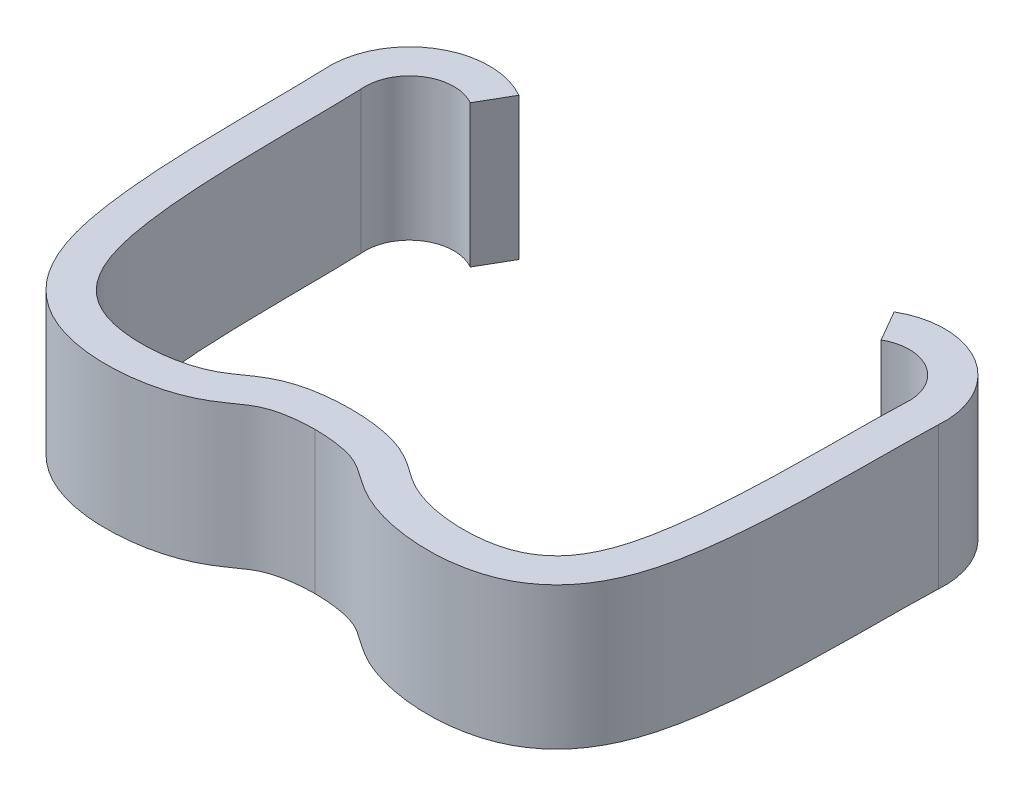
ISO-10303-21;
HEADER;
FILE_DESCRIPTION(('STEP AP214'),'2;1');
FILE_NAME('part.step','',(''),(''),'','','');
FILE_SCHEMA(('AUTOMOTIVE_DESIGN { 1 0 10303 214 1 1 1 1 }'));
ENDSEC;
DATA;
#1=APPLICATION_CONTEXT('core data for automotive mechanical design processes');
#2=APPLICATION_PROTOCOL_DEFINITION('international standard','automotive_design',2000,#1);
#3=PRODUCT_CONTEXT('',#1,'mechanical');
#4=PRODUCT('Part','Part','',(#3));
#5=PRODUCT_RELATED_PRODUCT_CATEGORY('part','',(#4));
#6=PRODUCT_DEFINITION_FORMATION('','',#4);
#7=PRODUCT_DEFINITION_CONTEXT('part definition',#1,'design');
#8=PRODUCT_DEFINITION('design','',#6,#7);
#9=PRODUCT_DEFINITION_SHAPE('','',#8);
#10=(LENGTH_UNIT() NAMED_UNIT(*) SI_UNIT(.MILLI.,.METRE.));
#11=(NAMED_UNIT(*) PLANE_ANGLE_UNIT() SI_UNIT($,.RADIAN.));
#12=(NAMED_UNIT(*) SI_UNIT($,.STERADIAN.) SOLID_ANGLE_UNIT());
#13=UNCERTAINTY_MEASURE_WITH_UNIT(LENGTH_MEASURE(1.E-05),#10,'distance_accuracy_value','');
#14=(GEOMETRIC_REPRESENTATION_CONTEXT(3) GLOBAL_UNCERTAINTY_ASSIGNED_CONTEXT((#13)) GLOBAL_UNIT_ASSIGNED_CONTEXT((#10,
#11,#12)) REPRESENTATION_CONTEXT('',''));
#15=CARTESIAN_POINT('',(0.,0.,0.));
#16=DIRECTION('',(0.,0.,1.));
#17=DIRECTION('',(1.,0.,0.));
#18=AXIS2_PLACEMENT_3D('',#15,#16,#17);
#19=CARTESIAN_POINT('',(-16.,10.,0.));
#20=DIRECTION('',(0.,-1.,0.));
#21=DIRECTION('',(0.,0.,-1.));
#22=AXIS2_PLACEMENT_3D('',#19,#20,#21);
#23=CYLINDRICAL_SURFACE('',#22,5.625);
#24=CARTESIAN_POINT('',(-16.,0.,0.));
#25=DIRECTION('',(0.,1.,0.));
#26=DIRECTION('',(0.,0.,1.));
#27=AXIS2_PLACEMENT_3D('',#24,#25,#26);
#28=CIRCLE('',#27,5.625);
#29=CARTESIAN_POINT('',(-13.1875,0.,-4.87139289628746));
#30=VERTEX_POINT('',#29);
#31=CARTESIAN_POINT('',(-21.6076901333347,0.,0.44094939448909));
#32=VERTEX_POINT('',#31);
#33=EDGE_CURVE('E208',#30,#32,#28,.T.);
#34=ORIENTED_EDGE('',*,*,#33,.T.);
#35=DIRECTION('',(0.,-1.,0.));
#36=VECTOR('',#35,1.);
#37=CARTESIAN_POINT('',(-21.6076901333347,10.,0.44094939448909));
#38=LINE('',#37,#36);
#39=CARTESIAN_POINT('',(-21.6076901333347,10.,0.44094939448909));
#40=VERTEX_POINT('',#39);
#41=EDGE_CURVE('E11',#40,#32,#38,.T.);
#42=ORIENTED_EDGE('',*,*,#41,.F.);
#43=CARTESIAN_POINT('',(-16.,10.,0.));
#44=DIRECTION('',(0.,1.,0.));
#45=DIRECTION('',(0.,0.,1.));
#46=AXIS2_PLACEMENT_3D('',#43,#44,#45);
#47=CIRCLE('',#46,5.625);
#48=CARTESIAN_POINT('',(-13.1875,10.,-4.87139289628746));
#49=VERTEX_POINT('',#48);
#50=EDGE_CURVE('E231',#49,#40,#47,.T.);
#51=ORIENTED_EDGE('',*,*,#50,.F.);
#52=DIRECTION('',(0.,-1.,0.));
#53=VECTOR('',#52,1.);
#54=CARTESIAN_POINT('',(-13.1875,10.,-4.87139289628746));
#55=LINE('',#54,#53);
#56=EDGE_CURVE('E207',#49,#30,#55,.T.);
#57=ORIENTED_EDGE('',*,*,#56,.T.);
#58=EDGE_LOOP('',(#34,#42,#51,#57));
#59=FACE_BOUND('',#58,.T.);
#60=ADVANCED_FACE('F35',(#59),#23,.T.);
#61=CARTESIAN_POINT('',(-21.6219283607129,10.,0.123890118522856));
#62=CARTESIAN_POINT('',(-21.6146337999332,10.,0.270907458622705));
#63=CARTESIAN_POINT('',(-21.602444684136,10.,0.555639378549982));
#64=CARTESIAN_POINT('',(-21.581483098417,10.,1.20057483207771));
#65=CARTESIAN_POINT('',(-21.5634413606094,10.,2.08484165586611));
#66=CARTESIAN_POINT('',(-21.5499995461205,10.,3.26385352737051));
#67=CARTESIAN_POINT('',(-21.5372211205893,10.,4.95933485482449));
#68=CARTESIAN_POINT('',(-21.5189118447884,10.,7.26459006225195));
#69=CARTESIAN_POINT('',(-21.4538134826111,10.,10.1846515740743));
#70=CARTESIAN_POINT('',(-21.3050356283683,10.,13.1265244944977));
#71=CARTESIAN_POINT('',(-21.0269231651929,10.,15.9665863770045));
#72=CARTESIAN_POINT('',(-20.5704017791859,10.,18.6069338161627));
#73=CARTESIAN_POINT('',(-19.7776823708247,10.,21.0892285009909));
#74=CARTESIAN_POINT('',(-18.3770463268046,10.,23.3779332616362));
#75=CARTESIAN_POINT('',(-16.1351830401088,10.,25.1476529540987));
#76=CARTESIAN_POINT('',(-13.2678501313841,10.,25.9978332084667));
#77=CARTESIAN_POINT('',(-10.7172773804907,10.,26.0650175697744));
#78=CARTESIAN_POINT('',(-8.67143886671049,10.,25.7904428629924));
#79=CARTESIAN_POINT('',(-7.41767780962246,10.,25.4638715882414));
#80=CARTESIAN_POINT('',(-6.44842602371671,10.,25.0956166688921));
#81=CARTESIAN_POINT('',(-5.72988490447921,10.,24.7517410122022));
#82=CARTESIAN_POINT('',(-5.0761458871409,10.,24.3542968347593));
#83=CARTESIAN_POINT('',(-4.39264050595582,10.,23.8768194772862));
#84=CARTESIAN_POINT('',(-3.7655304640169,10.,23.4318841711946));
#85=CARTESIAN_POINT('',(-3.19400356367894,10.,23.134099238582));
#86=CARTESIAN_POINT('',(-2.54250472768997,10.,22.9160334848559));
#87=CARTESIAN_POINT('',(-1.90399652052193,10.,22.7726014723141));
#88=CARTESIAN_POINT('',(-1.20595712813709,10.,22.6825803810841));
#89=CARTESIAN_POINT('',(-0.544804090207386,10.,22.6385258496257));
#90=CARTESIAN_POINT('',(-0.155887299716033,10.,22.6271535118445));
#91=CARTESIAN_POINT('',(0.0313759444706018,10.,22.624803102268));
#92=B_SPLINE_CURVE_WITH_KNOTS('',3,(#61,#62,#63,#64,#65,#66,#67,#68,#69,#70,#71,#72,#73,#74,#75,
#76,#77,#78,#79,#80,#81,#82,#83,#84,#85,#86,#87,#88,#89,#90,#91),.UNSPECIFIED.,.F.,.F.,(4,1,1,1,
1,1,1,1,1,1,1,1,1,1,1,1,1,1,1,1,1,1,1,1,1,1,1,1,4),(0.,0.015625,0.03125,0.0625,0.09375,0.125,
0.1875,0.25,0.3125,0.375,0.4375,0.5,0.5625,0.625,0.6875,0.75,0.78125,0.8125,0.828125,0.84375,
0.859375,0.875,0.90625,0.9375,0.953125,0.96875,0.984375,0.9921875,1.),.UNSPECIFIED.);
#93=DIRECTION('',(0.,-1.,0.));
#94=VECTOR('',#93,1.);
#95=SURFACE_OF_LINEAR_EXTRUSION('',#92,#94);
#96=CARTESIAN_POINT('',(-21.6219283607129,0.,0.123890118522856));
#97=CARTESIAN_POINT('',(-21.6146337999332,0.,0.270907458622705));
#98=CARTESIAN_POINT('',(-21.602444684136,0.,0.555639378549982));
#99=CARTESIAN_POINT('',(-21.581483098417,0.,1.20057483207771));
#100=CARTESIAN_POINT('',(-21.5634413606094,0.,2.08484165586611));
#101=CARTESIAN_POINT('',(-21.5499995461205,0.,3.26385352737051));
#102=CARTESIAN_POINT('',(-21.5372211205893,0.,4.95933485482449));
#103=CARTESIAN_POINT('',(-21.5189118447884,0.,7.26459006225195));
#104=CARTESIAN_POINT('',(-21.4538134826111,0.,10.1846515740743));
#105=CARTESIAN_POINT('',(-21.3050356283683,0.,13.1265244944977));
#106=CARTESIAN_POINT('',(-21.0269231651929,0.,15.9665863770045));
#107=CARTESIAN_POINT('',(-20.5704017791859,0.,18.6069338161627));
#108=CARTESIAN_POINT('',(-19.7776823708247,0.,21.0892285009909));
#109=CARTESIAN_POINT('',(-18.3770463268046,0.,23.3779332616362));
#110=CARTESIAN_POINT('',(-16.1351830401088,0.,25.1476529540987));
#111=CARTESIAN_POINT('',(-13.2678501313841,0.,25.9978332084667));
#112=CARTESIAN_POINT('',(-10.7172773804907,0.,26.0650175697744));
#113=CARTESIAN_POINT('',(-8.67143886671049,0.,25.7904428629924));
#114=CARTESIAN_POINT('',(-7.41767780962246,0.,25.4638715882414));
#115=CARTESIAN_POINT('',(-6.44842602371671,0.,25.0956166688921));
#116=CARTESIAN_POINT('',(-5.72988490447921,0.,24.7517410122022));
#117=CARTESIAN_POINT('',(-5.0761458871409,0.,24.3542968347593));
#118=CARTESIAN_POINT('',(-4.39264050595582,0.,23.8768194772862));
#119=CARTESIAN_POINT('',(-3.7655304640169,0.,23.4318841711946));
#120=CARTESIAN_POINT('',(-3.19400356367894,0.,23.134099238582));
#121=CARTESIAN_POINT('',(-2.54250472768997,0.,22.9160334848559));
#122=CARTESIAN_POINT('',(-1.90399652052193,0.,22.7726014723141));
#123=CARTESIAN_POINT('',(-1.20595712813709,0.,22.6825803810841));
#124=CARTESIAN_POINT('',(-0.544804090207386,0.,22.6385258496257));
#125=CARTESIAN_POINT('',(-0.155887299716033,0.,22.6271535118445));
#126=CARTESIAN_POINT('',(0.0313759444706018,0.,22.624803102268));
#127=B_SPLINE_CURVE_WITH_KNOTS('',3,(#96,#97,#98,#99,#100,#101,#102,#103,#104,#105,#106,#107,
#108,#109,#110,#111,#112,#113,#114,#115,#116,#117,#118,#119,#120,#121,#122,#123,#124,#125,#126),
.UNSPECIFIED.,.F.,.F.,(4,1,1,1,1,1,1,1,1,1,1,1,1,1,1,1,1,1,1,1,1,1,1,1,1,1,1,1,4),(0.,0.015625,
0.03125,0.0625,0.09375,0.125,0.1875,0.25,0.3125,0.375,0.4375,0.5,0.5625,0.625,0.6875,0.75,
0.78125,0.8125,0.828125,0.84375,0.859375,0.875,0.90625,0.9375,0.953125,0.96875,0.984375,
0.9921875,1.),.UNSPECIFIED.);
#128=CARTESIAN_POINT('',(-3.37868120152851E-08,0.,22.6252270911521));
#129=VERTEX_POINT('',#128);
#130=EDGE_CURVE('E211',#32,#129,#127,.T.);
#131=ORIENTED_EDGE('',*,*,#130,.T.);
#132=DIRECTION('',(0.,-1.,0.));
#133=VECTOR('',#132,1.);
#134=CARTESIAN_POINT('',(0.,10.,22.6252270916409));
#135=LINE('',#134,#133);
#136=CARTESIAN_POINT('',(-3.37868120152851E-08,10.,22.6252270911521));
#137=VERTEX_POINT('',#136);
#138=EDGE_CURVE('E129',#129,#137,#135,.F.);
#139=ORIENTED_EDGE('',*,*,#138,.T.);
#140=EDGE_CURVE('E81',#40,#137,#92,.T.);
#141=ORIENTED_EDGE('',*,*,#140,.F.);
#142=ORIENTED_EDGE('',*,*,#41,.T.);
#143=EDGE_LOOP('',(#131,#139,#141,#142));
#144=FACE_BOUND('',#143,.T.);
#145=ADVANCED_FACE('F187',(#144),#95,.F.);
#146=CARTESIAN_POINT('',(-19.125,10.,0.));
#147=CARTESIAN_POINT('',(-18.9378789635887,10.,3.77130822273864));
#148=CARTESIAN_POINT('',(-19.429246011893,10.,16.1110240452031));
#149=CARTESIAN_POINT('',(-16.0735226230496,10.,24.1093593427401));
#150=CARTESIAN_POINT('',(-6.26928183090484,10.,23.3561417046772));
#151=CARTESIAN_POINT('',(-4.45766076868446,10.,20.1809497332489));
#152=CARTESIAN_POINT('',(0.,10.,20.125));
#153=B_SPLINE_CURVE_WITH_KNOTS('',3,(#146,#147,#148,#149,#150,#151,#152),.UNSPECIFIED.,.F.,.F.,
(4,1,1,1,4),(0.,0.388495821340989,0.663537305837103,0.845127061669236,1.),.UNSPECIFIED.);
#154=DIRECTION('',(0.,-1.,0.));
#155=VECTOR('',#154,1.);
#156=SURFACE_OF_LINEAR_EXTRUSION('',#153,#155);
#157=CARTESIAN_POINT('',(-19.125,0.,0.));
#158=CARTESIAN_POINT('',(-18.9378789635887,0.,3.77130822273864));
#159=CARTESIAN_POINT('',(-19.429246011893,0.,16.1110240452031));
#160=CARTESIAN_POINT('',(-16.0735226230496,0.,24.1093593427401));
#161=CARTESIAN_POINT('',(-6.26928183090484,0.,23.3561417046772));
#162=CARTESIAN_POINT('',(-4.45766076868446,0.,20.1809497332489));
#163=CARTESIAN_POINT('',(0.,0.,20.125));
#164=B_SPLINE_CURVE_WITH_KNOTS('',3,(#157,#158,#159,#160,#161,#162,#163),.UNSPECIFIED.,.F.,.F.,
(4,1,1,1,4),(0.,0.388495821340989,0.663537305837103,0.845127061669236,1.),.UNSPECIFIED.);
#165=CARTESIAN_POINT('',(-19.1120360022778,0.,0.284353513300806));
#166=VERTEX_POINT('',#165);
#167=CARTESIAN_POINT('',(0.,0.,20.125));
#168=VERTEX_POINT('',#167);
#169=EDGE_CURVE('E216',#166,#168,#164,.T.);
#170=ORIENTED_EDGE('',*,*,#169,.F.);
#171=DIRECTION('',(0.,-1.,0.));
#172=VECTOR('',#171,1.);
#173=CARTESIAN_POINT('',(-19.1120360022778,10.,0.284353513300806));
#174=LINE('',#173,#172);
#175=CARTESIAN_POINT('',(-19.1120360022778,10.,0.284353513300806));
#176=VERTEX_POINT('',#175);
#177=EDGE_CURVE('E234',#176,#166,#174,.T.);
#178=ORIENTED_EDGE('',*,*,#177,.F.);
#179=CARTESIAN_POINT('',(0.,10.,20.125));
#180=VERTEX_POINT('',#179);
#181=EDGE_CURVE('E190',#176,#180,#153,.T.);
#182=ORIENTED_EDGE('',*,*,#181,.T.);
#183=DIRECTION('',(0.,-1.,0.));
#184=VECTOR('',#183,1.);
#185=CARTESIAN_POINT('',(0.,10.,20.125));
#186=LINE('',#185,#184);
#187=EDGE_CURVE('E43',#180,#168,#186,.T.);
#188=ORIENTED_EDGE('',*,*,#187,.T.);
#189=EDGE_LOOP('',(#170,#178,#182,#188));
#190=FACE_BOUND('',#189,.T.);
#191=ADVANCED_FACE('F183',(#190),#156,.T.);
#192=CARTESIAN_POINT('',(-16.,10.,0.));
#193=DIRECTION('',(0.,-1.,0.));
#194=DIRECTION('',(0.,0.,-1.));
#195=AXIS2_PLACEMENT_3D('',#192,#193,#194);
#196=CYLINDRICAL_SURFACE('',#195,3.125);
#197=CARTESIAN_POINT('',(-16.,0.,0.));
#198=DIRECTION('',(0.,1.,0.));
#199=DIRECTION('',(0.,0.,1.));
#200=AXIS2_PLACEMENT_3D('',#197,#198,#199);
#201=CIRCLE('',#200,3.125);
#202=CARTESIAN_POINT('',(-14.4375,0.,-2.70632938682637));
#203=VERTEX_POINT('',#202);
#204=EDGE_CURVE('E224',#203,#166,#201,.T.);
#205=ORIENTED_EDGE('',*,*,#204,.F.);
#206=DIRECTION('',(0.,-1.,0.));
#207=VECTOR('',#206,1.);
#208=CARTESIAN_POINT('',(-14.4375,10.,-2.70632938682637));
#209=LINE('',#208,#207);
#210=CARTESIAN_POINT('',(-14.4375,10.,-2.70632938682637));
#211=VERTEX_POINT('',#210);
#212=EDGE_CURVE('E71',#211,#203,#209,.T.);
#213=ORIENTED_EDGE('',*,*,#212,.F.);
#214=CARTESIAN_POINT('',(-16.,10.,0.));
#215=DIRECTION('',(0.,1.,0.));
#216=DIRECTION('',(0.,0.,1.));
#217=AXIS2_PLACEMENT_3D('',#214,#215,#216);
#218=CIRCLE('',#217,3.125);
#219=EDGE_CURVE('E196',#211,#176,#218,.T.);
#220=ORIENTED_EDGE('',*,*,#219,.T.);
#221=ORIENTED_EDGE('',*,*,#177,.T.);
#222=EDGE_LOOP('',(#205,#213,#220,#221));
#223=FACE_BOUND('',#222,.T.);
#224=ADVANCED_FACE('F180',(#223),#196,.F.);
#225=CARTESIAN_POINT('',(-12.,10.,-6.92820323027552));
#226=DIRECTION('',(-0.866025403784438,0.,-0.500000000000001));
#227=DIRECTION('',(-0.500000000000001,0.,0.866025403784438));
#228=AXIS2_PLACEMENT_3D('',#225,#226,#227);
#229=PLANE('',#228);
#230=DIRECTION('',(0.500000000000001,0.,-0.866025403784438));
#231=VECTOR('',#230,1.);
#232=CARTESIAN_POINT('',(-12.,0.,-6.92820323027552));
#233=LINE('',#232,#231);
#234=EDGE_CURVE('E74',#203,#30,#233,.T.);
#235=ORIENTED_EDGE('',*,*,#234,.T.);
#236=ORIENTED_EDGE('',*,*,#56,.F.);
#237=DIRECTION('',(0.500000000000001,0.,-0.866025403784438));
#238=VECTOR('',#237,1.);
#239=CARTESIAN_POINT('',(-12.,10.,-6.92820323027552));
#240=LINE('',#239,#238);
#241=EDGE_CURVE('E51',#211,#49,#240,.T.);
#242=ORIENTED_EDGE('',*,*,#241,.F.);
#243=ORIENTED_EDGE('',*,*,#212,.T.);
#244=EDGE_LOOP('',(#235,#236,#242,#243));
#245=FACE_BOUND('',#244,.T.);
#246=ADVANCED_FACE('F174',(#245),#229,.F.);
#247=CARTESIAN_POINT('',(0.,10.,0.));
#248=DIRECTION('',(0.,1.,0.));
#249=DIRECTION('',(0.,0.,1.));
#250=AXIS2_PLACEMENT_3D('',#247,#248,#249);
#251=PLANE('',#250);
#252=ORIENTED_EDGE('',*,*,#140,.T.);
#253=CARTESIAN_POINT('',(21.6219283607129,10.,0.123890118522856));
#254=CARTESIAN_POINT('',(21.6146337999332,10.,0.270907458622705));
#255=CARTESIAN_POINT('',(21.602444684136,10.,0.555639378549982));
#256=CARTESIAN_POINT('',(21.581483098417,10.,1.20057483207771));
#257=CARTESIAN_POINT('',(21.5634413606094,10.,2.08484165586611));
#258=CARTESIAN_POINT('',(21.5499995461205,10.,3.26385352737051));
#259=CARTESIAN_POINT('',(21.5372211205893,10.,4.95933485482449));
#260=CARTESIAN_POINT('',(21.5189118447884,10.,7.26459006225195));
#261=CARTESIAN_POINT('',(21.4538134826111,10.,10.1846515740743));
#262=CARTESIAN_POINT('',(21.3050356283683,10.,13.1265244944977));
#263=CARTESIAN_POINT('',(21.0269231651929,10.,15.9665863770045));
#264=CARTESIAN_POINT('',(20.5704017791859,10.,18.6069338161627));
#265=CARTESIAN_POINT('',(19.7776823708247,10.,21.0892285009909));
#266=CARTESIAN_POINT('',(18.3770463268046,10.,23.3779332616362));
#267=CARTESIAN_POINT('',(16.1351830401088,10.,25.1476529540987));
#268=CARTESIAN_POINT('',(13.2678501313841,10.,25.9978332084667));
#269=CARTESIAN_POINT('',(10.7172773804907,10.,26.0650175697744));
#270=CARTESIAN_POINT('',(8.67143886671049,10.,25.7904428629924));
#271=CARTESIAN_POINT('',(7.41767780962246,10.,25.4638715882414));
#272=CARTESIAN_POINT('',(6.44842602371671,10.,25.0956166688921));
#273=CARTESIAN_POINT('',(5.72988490447921,10.,24.7517410122022));
#274=CARTESIAN_POINT('',(5.0761458871409,10.,24.3542968347593));
#275=CARTESIAN_POINT('',(4.39264050595582,10.,23.8768194772862));
#276=CARTESIAN_POINT('',(3.7655304640169,10.,23.4318841711946));
#277=CARTESIAN_POINT('',(3.19400356367894,10.,23.134099238582));
#278=CARTESIAN_POINT('',(2.54250472768997,10.,22.9160334848559));
#279=CARTESIAN_POINT('',(1.90399652052193,10.,22.7726014723141));
#280=CARTESIAN_POINT('',(1.20595712813709,10.,22.6825803810841));
#281=CARTESIAN_POINT('',(0.544804090207386,10.,22.6385258496257));
#282=CARTESIAN_POINT('',(0.155887299716033,10.,22.6271535118445));
#283=CARTESIAN_POINT('',(-0.0313759444706018,10.,22.624803102268));
#284=B_SPLINE_CURVE_WITH_KNOTS('',3,(#253,#254,#255,#256,#257,#258,#259,#260,#261,#262,#263,
#264,#265,#266,#267,#268,#269,#270,#271,#272,#273,#274,#275,#276,#277,#278,#279,#280,#281,#282,
#283),.UNSPECIFIED.,.F.,.F.,(4,1,1,1,1,1,1,1,1,1,1,1,1,1,1,1,1,1,1,1,1,1,1,1,1,1,1,1,4),(0.,
0.015625,0.03125,0.0625,0.09375,0.125,0.1875,0.25,0.3125,0.375,0.4375,0.5,0.5625,0.625,0.6875,
0.75,0.78125,0.8125,0.828125,0.84375,0.859375,0.875,0.90625,0.9375,0.953125,0.96875,0.984375,
0.9921875,1.),.UNSPECIFIED.);
#285=CARTESIAN_POINT('',(21.6076901333347,10.,0.44094939448909));
#286=VERTEX_POINT('',#285);
#287=EDGE_CURVE('E135',#286,#137,#284,.T.);
#288=ORIENTED_EDGE('',*,*,#287,.F.);
#289=CARTESIAN_POINT('',(16.,10.,0.));
#290=DIRECTION('',(0.,-1.,0.));
#291=DIRECTION('',(0.,0.,1.));
#292=AXIS2_PLACEMENT_3D('',#289,#290,#291);
#293=CIRCLE('',#292,5.625);
#294=CARTESIAN_POINT('',(13.1875,10.,-4.87139289628746));
#295=VERTEX_POINT('',#294);
#296=EDGE_CURVE('E121',#295,#286,#293,.T.);
#297=ORIENTED_EDGE('',*,*,#296,.F.);
#298=DIRECTION('',(-0.500000000000001,0.,-0.866025403784438));
#299=VECTOR('',#298,1.);
#300=CARTESIAN_POINT('',(12.,10.,-6.92820323027552));
#301=LINE('',#300,#299);
#302=CARTESIAN_POINT('',(14.4375,10.,-2.70632938682637));
#303=VERTEX_POINT('',#302);
#304=EDGE_CURVE('E134',#303,#295,#301,.T.);
#305=ORIENTED_EDGE('',*,*,#304,.F.);
#306=CARTESIAN_POINT('',(16.,10.,0.));
#307=DIRECTION('',(0.,-1.,0.));
#308=DIRECTION('',(0.,0.,1.));
#309=AXIS2_PLACEMENT_3D('',#306,#307,#308);
#310=CIRCLE('',#309,3.125);
#311=CARTESIAN_POINT('',(19.1120360022778,10.,0.284353513300806));
#312=VERTEX_POINT('',#311);
#313=EDGE_CURVE('E140',#303,#312,#310,.T.);
#314=ORIENTED_EDGE('',*,*,#313,.T.);
#315=CARTESIAN_POINT('',(19.125,10.,0.));
#316=CARTESIAN_POINT('',(18.9378789635887,10.,3.77130822273864));
#317=CARTESIAN_POINT('',(19.429246011893,10.,16.1110240452031));
#318=CARTESIAN_POINT('',(16.0735226230496,10.,24.1093593427401));
#319=CARTESIAN_POINT('',(6.26928183090484,10.,23.3561417046772));
#320=CARTESIAN_POINT('',(4.45766076868446,10.,20.1809497332489));
#321=CARTESIAN_POINT('',(0.,10.,20.125));
#322=B_SPLINE_CURVE_WITH_KNOTS('',3,(#315,#316,#317,#318,#319,#320,#321),.UNSPECIFIED.,.F.,.F.,
(4,1,1,1,4),(0.,0.388495821340989,0.663537305837103,0.845127061669236,1.),.UNSPECIFIED.);
#323=EDGE_CURVE('E142',#312,#180,#322,.T.);
#324=ORIENTED_EDGE('',*,*,#323,.T.);
#325=ORIENTED_EDGE('',*,*,#181,.F.);
#326=ORIENTED_EDGE('',*,*,#219,.F.);
#327=ORIENTED_EDGE('',*,*,#241,.T.);
#328=ORIENTED_EDGE('',*,*,#50,.T.);
#329=EDGE_LOOP('',(#252,#288,#297,#305,#314,#324,#325,#326,#327,#328));
#330=FACE_BOUND('',#329,.T.);
#331=ADVANCED_FACE('F133',(#330),#251,.T.);
#332=CARTESIAN_POINT('',(0.,0.,0.));
#333=DIRECTION('',(0.,1.,0.));
#334=DIRECTION('',(0.,0.,1.));
#335=AXIS2_PLACEMENT_3D('',#332,#333,#334);
#336=PLANE('',#335);
#337=ORIENTED_EDGE('',*,*,#169,.T.);
#338=CARTESIAN_POINT('',(19.125,0.,0.));
#339=CARTESIAN_POINT('',(18.9378789635887,0.,3.77130822273864));
#340=CARTESIAN_POINT('',(19.429246011893,0.,16.1110240452031));
#341=CARTESIAN_POINT('',(16.0735226230496,0.,24.1093593427401));
#342=CARTESIAN_POINT('',(6.26928183090484,0.,23.3561417046772));
#343=CARTESIAN_POINT('',(4.45766076868446,0.,20.1809497332489));
#344=CARTESIAN_POINT('',(0.,0.,20.125));
#345=B_SPLINE_CURVE_WITH_KNOTS('',3,(#338,#339,#340,#341,#342,#343,#344),.UNSPECIFIED.,.F.,.F.,
(4,1,1,1,4),(0.,0.388495821340989,0.663537305837103,0.845127061669236,1.),.UNSPECIFIED.);
#346=CARTESIAN_POINT('',(19.1120360022778,0.,0.284353513300806));
#347=VERTEX_POINT('',#346);
#348=EDGE_CURVE('E242',#347,#168,#345,.T.);
#349=ORIENTED_EDGE('',*,*,#348,.F.);
#350=CARTESIAN_POINT('',(16.,0.,0.));
#351=DIRECTION('',(0.,-1.,0.));
#352=DIRECTION('',(0.,0.,1.));
#353=AXIS2_PLACEMENT_3D('',#350,#351,#352);
#354=CIRCLE('',#353,3.125);
#355=CARTESIAN_POINT('',(14.4375,0.,-2.70632938682637));
#356=VERTEX_POINT('',#355);
#357=EDGE_CURVE('E260',#356,#347,#354,.T.);
#358=ORIENTED_EDGE('',*,*,#357,.F.);
#359=DIRECTION('',(-0.500000000000001,0.,-0.866025403784438));
#360=VECTOR('',#359,1.);
#361=CARTESIAN_POINT('',(12.,0.,-6.92820323027552));
#362=LINE('',#361,#360);
#363=CARTESIAN_POINT('',(13.1875,0.,-4.87139289628746));
#364=VERTEX_POINT('',#363);
#365=EDGE_CURVE('E274',#356,#364,#362,.T.);
#366=ORIENTED_EDGE('',*,*,#365,.T.);
#367=CARTESIAN_POINT('',(16.,0.,0.));
#368=DIRECTION('',(0.,-1.,0.));
#369=DIRECTION('',(0.,0.,1.));
#370=AXIS2_PLACEMENT_3D('',#367,#368,#369);
#371=CIRCLE('',#370,5.625);
#372=CARTESIAN_POINT('',(21.6076901333347,0.,0.44094939448909));
#373=VERTEX_POINT('',#372);
#374=EDGE_CURVE('E124',#364,#373,#371,.T.);
#375=ORIENTED_EDGE('',*,*,#374,.T.);
#376=CARTESIAN_POINT('',(21.6219283607129,0.,0.123890118522856));
#377=CARTESIAN_POINT('',(21.6146337999332,0.,0.270907458622705));
#378=CARTESIAN_POINT('',(21.602444684136,0.,0.555639378549982));
#379=CARTESIAN_POINT('',(21.581483098417,0.,1.20057483207771));
#380=CARTESIAN_POINT('',(21.5634413606094,0.,2.08484165586611));
#381=CARTESIAN_POINT('',(21.5499995461205,0.,3.26385352737051));
#382=CARTESIAN_POINT('',(21.5372211205893,0.,4.95933485482449));
#383=CARTESIAN_POINT('',(21.5189118447884,0.,7.26459006225195));
#384=CARTESIAN_POINT('',(21.4538134826111,0.,10.1846515740743));
#385=CARTESIAN_POINT('',(21.3050356283683,0.,13.1265244944977));
#386=CARTESIAN_POINT('',(21.0269231651929,0.,15.9665863770045));
#387=CARTESIAN_POINT('',(20.5704017791859,0.,18.6069338161627));
#388=CARTESIAN_POINT('',(19.7776823708247,0.,21.0892285009909));
#389=CARTESIAN_POINT('',(18.3770463268046,0.,23.3779332616362));
#390=CARTESIAN_POINT('',(16.1351830401088,0.,25.1476529540987));
#391=CARTESIAN_POINT('',(13.2678501313841,0.,25.9978332084667));
#392=CARTESIAN_POINT('',(10.7172773804907,0.,26.0650175697744));
#393=CARTESIAN_POINT('',(8.67143886671049,0.,25.7904428629924));
#394=CARTESIAN_POINT('',(7.41767780962246,0.,25.4638715882414));
#395=CARTESIAN_POINT('',(6.44842602371671,0.,25.0956166688921));
#396=CARTESIAN_POINT('',(5.72988490447921,0.,24.7517410122022));
#397=CARTESIAN_POINT('',(5.0761458871409,0.,24.3542968347593));
#398=CARTESIAN_POINT('',(4.39264050595582,0.,23.8768194772862));
#399=CARTESIAN_POINT('',(3.7655304640169,0.,23.4318841711946));
#400=CARTESIAN_POINT('',(3.19400356367894,0.,23.134099238582));
#401=CARTESIAN_POINT('',(2.54250472768997,0.,22.9160334848559));
#402=CARTESIAN_POINT('',(1.90399652052193,0.,22.7726014723141));
#403=CARTESIAN_POINT('',(1.20595712813709,0.,22.6825803810841));
#404=CARTESIAN_POINT('',(0.544804090207386,0.,22.6385258496257));
#405=CARTESIAN_POINT('',(0.155887299716033,0.,22.6271535118445));
#406=CARTESIAN_POINT('',(-0.0313759444706018,0.,22.624803102268));
#407=B_SPLINE_CURVE_WITH_KNOTS('',3,(#376,#377,#378,#379,#380,#381,#382,#383,#384,#385,#386,
#387,#388,#389,#390,#391,#392,#393,#394,#395,#396,#397,#398,#399,#400,#401,#402,#403,#404,#405,
#406),.UNSPECIFIED.,.F.,.F.,(4,1,1,1,1,1,1,1,1,1,1,1,1,1,1,1,1,1,1,1,1,1,1,1,1,1,1,1,4),(0.,
0.015625,0.03125,0.0625,0.09375,0.125,0.1875,0.25,0.3125,0.375,0.4375,0.5,0.5625,0.625,0.6875,
0.75,0.78125,0.8125,0.828125,0.84375,0.859375,0.875,0.90625,0.9375,0.953125,0.96875,0.984375,
0.9921875,1.),.UNSPECIFIED.);
#408=EDGE_CURVE('E136',#373,#129,#407,.T.);
#409=ORIENTED_EDGE('',*,*,#408,.T.);
#410=ORIENTED_EDGE('',*,*,#130,.F.);
#411=ORIENTED_EDGE('',*,*,#33,.F.);
#412=ORIENTED_EDGE('',*,*,#234,.F.);
#413=ORIENTED_EDGE('',*,*,#204,.T.);
#414=EDGE_LOOP('',(#337,#349,#358,#366,#375,#409,#410,#411,#412,#413));
#415=FACE_BOUND('',#414,.T.);
#416=ADVANCED_FACE('F173',(#415),#336,.F.);
#417=DIRECTION('',(0.,-1.,0.));
#418=VECTOR('',#417,1.);
#419=SURFACE_OF_LINEAR_EXTRUSION('',#284,#418);
#420=ORIENTED_EDGE('',*,*,#138,.F.);
#421=ORIENTED_EDGE('',*,*,#408,.F.);
#422=DIRECTION('',(0.,-1.,0.));
#423=VECTOR('',#422,1.);
#424=CARTESIAN_POINT('',(21.6076901333347,10.,0.44094939448909));
#425=LINE('',#424,#423);
#426=EDGE_CURVE('E248',#286,#373,#425,.T.);
#427=ORIENTED_EDGE('',*,*,#426,.F.);
#428=ORIENTED_EDGE('',*,*,#287,.T.);
#429=EDGE_LOOP('',(#420,#421,#427,#428));
#430=FACE_BOUND('',#429,.T.);
#431=ADVANCED_FACE('F163',(#430),#419,.T.);
#432=CARTESIAN_POINT('',(16.,10.,0.));
#433=DIRECTION('',(0.,-1.,0.));
#434=DIRECTION('',(0.,0.,-1.));
#435=AXIS2_PLACEMENT_3D('',#432,#433,#434);
#436=CYLINDRICAL_SURFACE('',#435,5.625);
#437=ORIENTED_EDGE('',*,*,#374,.F.);
#438=DIRECTION('',(0.,-1.,0.));
#439=VECTOR('',#438,1.);
#440=CARTESIAN_POINT('',(13.1875,10.,-4.87139289628746));
#441=LINE('',#440,#439);
#442=EDGE_CURVE('E118',#295,#364,#441,.T.);
#443=ORIENTED_EDGE('',*,*,#442,.F.);
#444=ORIENTED_EDGE('',*,*,#296,.T.);
#445=ORIENTED_EDGE('',*,*,#426,.T.);
#446=EDGE_LOOP('',(#437,#443,#444,#445));
#447=FACE_BOUND('',#446,.T.);
#448=ADVANCED_FACE('F120',(#447),#436,.T.);
#449=CARTESIAN_POINT('',(12.,10.,-6.92820323027552));
#450=DIRECTION('',(-0.866025403784438,0.,0.500000000000001));
#451=DIRECTION('',(0.500000000000001,0.,0.866025403784438));
#452=AXIS2_PLACEMENT_3D('',#449,#450,#451);
#453=PLANE('',#452);
#454=ORIENTED_EDGE('',*,*,#365,.F.);
#455=DIRECTION('',(0.,-1.,0.));
#456=VECTOR('',#455,1.);
#457=CARTESIAN_POINT('',(14.4375,10.,-2.70632938682637));
#458=LINE('',#457,#456);
#459=EDGE_CURVE('E130',#303,#356,#458,.T.);
#460=ORIENTED_EDGE('',*,*,#459,.F.);
#461=ORIENTED_EDGE('',*,*,#304,.T.);
#462=ORIENTED_EDGE('',*,*,#442,.T.);
#463=EDGE_LOOP('',(#454,#460,#461,#462));
#464=FACE_BOUND('',#463,.T.);
#465=ADVANCED_FACE('F138',(#464),#453,.T.);
#466=CARTESIAN_POINT('',(16.,10.,0.));
#467=DIRECTION('',(0.,-1.,0.));
#468=DIRECTION('',(0.,0.,-1.));
#469=AXIS2_PLACEMENT_3D('',#466,#467,#468);
#470=CYLINDRICAL_SURFACE('',#469,3.125);
#471=ORIENTED_EDGE('',*,*,#357,.T.);
#472=DIRECTION('',(0.,-1.,0.));
#473=VECTOR('',#472,1.);
#474=CARTESIAN_POINT('',(19.1120360022778,10.,0.284353513300806));
#475=LINE('',#474,#473);
#476=EDGE_CURVE('E247',#312,#347,#475,.T.);
#477=ORIENTED_EDGE('',*,*,#476,.F.);
#478=ORIENTED_EDGE('',*,*,#313,.F.);
#479=ORIENTED_EDGE('',*,*,#459,.T.);
#480=EDGE_LOOP('',(#471,#477,#478,#479));
#481=FACE_BOUND('',#480,.T.);
#482=ADVANCED_FACE('F161',(#481),#470,.F.);
#483=DIRECTION('',(0.,-1.,0.));
#484=VECTOR('',#483,1.);
#485=SURFACE_OF_LINEAR_EXTRUSION('',#322,#484);
#486=ORIENTED_EDGE('',*,*,#348,.T.);
#487=ORIENTED_EDGE('',*,*,#187,.F.);
#488=ORIENTED_EDGE('',*,*,#323,.F.);
#489=ORIENTED_EDGE('',*,*,#476,.T.);
#490=EDGE_LOOP('',(#486,#487,#488,#489));
#491=FACE_BOUND('',#490,.T.);
#492=ADVANCED_FACE('F157',(#491),#485,.F.);
#493=CLOSED_SHELL('',(#60,#145,#191,#224,#246,#331,#416,#431,#448,#465,#482,#492));
#494=MANIFOLD_SOLID_BREP('B2',#493);
#495=ADVANCED_BREP_SHAPE_REPRESENTATION('',(#18,#494),#14);
#496=SHAPE_DEFINITION_REPRESENTATION(#9,#495);
ENDSEC;
END-ISO-10303-21;
